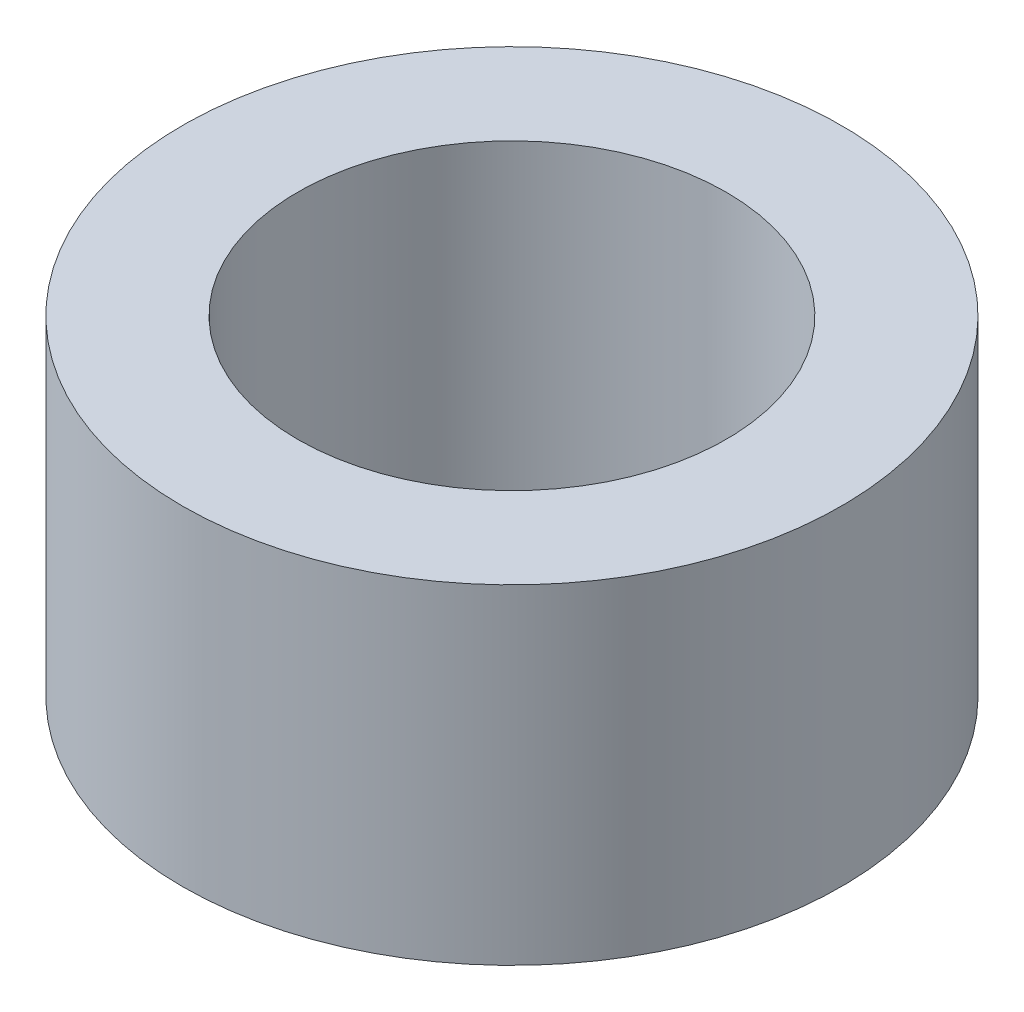
ISO-10303-21;
HEADER;
FILE_DESCRIPTION(('STEP AP214'),'2;1');
FILE_NAME('part.step','',(''),(''),'','','');
FILE_SCHEMA(('AUTOMOTIVE_DESIGN { 1 0 10303 214 1 1 1 1 }'));
ENDSEC;
DATA;
#1=APPLICATION_CONTEXT('core data for automotive mechanical design processes');
#2=APPLICATION_PROTOCOL_DEFINITION('international standard','automotive_design',2000,#1);
#3=PRODUCT_CONTEXT('',#1,'mechanical');
#4=PRODUCT('Part','Part','',(#3));
#5=PRODUCT_RELATED_PRODUCT_CATEGORY('part','',(#4));
#6=PRODUCT_DEFINITION_FORMATION('','',#4);
#7=PRODUCT_DEFINITION_CONTEXT('part definition',#1,'design');
#8=PRODUCT_DEFINITION('design','',#6,#7);
#9=PRODUCT_DEFINITION_SHAPE('','',#8);
#10=(LENGTH_UNIT() NAMED_UNIT(*) SI_UNIT(.MILLI.,.METRE.));
#11=(NAMED_UNIT(*) PLANE_ANGLE_UNIT() SI_UNIT($,.RADIAN.));
#12=(NAMED_UNIT(*) SI_UNIT($,.STERADIAN.) SOLID_ANGLE_UNIT());
#13=UNCERTAINTY_MEASURE_WITH_UNIT(LENGTH_MEASURE(1.E-05),#10,'distance_accuracy_value','');
#14=(GEOMETRIC_REPRESENTATION_CONTEXT(3) GLOBAL_UNCERTAINTY_ASSIGNED_CONTEXT((#13)) GLOBAL_UNIT_ASSIGNED_CONTEXT((#10,
#11,#12)) REPRESENTATION_CONTEXT('',''));
#15=CARTESIAN_POINT('',(0.,0.,0.));
#16=DIRECTION('',(0.,0.,1.));
#17=DIRECTION('',(1.,0.,0.));
#18=AXIS2_PLACEMENT_3D('',#15,#16,#17);
#19=CARTESIAN_POINT('',(0.,5.,0.));
#20=DIRECTION('',(0.,1.,0.));
#21=DIRECTION('',(0.,0.,1.));
#22=AXIS2_PLACEMENT_3D('',#19,#20,#21);
#23=PLANE('',#22);
#24=CARTESIAN_POINT('',(0.,5.,0.));
#25=DIRECTION('',(0.,1.,0.));
#26=DIRECTION('',(0.,0.,1.));
#27=AXIS2_PLACEMENT_3D('',#24,#25,#26);
#28=CIRCLE('',#27,5.);
#29=CARTESIAN_POINT('',(0.,5.,5.));
#30=VERTEX_POINT('',#29);
#31=EDGE_CURVE('E10',#30,#30,#28,.T.);
#32=ORIENTED_EDGE('',*,*,#31,.T.);
#33=EDGE_LOOP('',(#32));
#34=FACE_BOUND('',#33,.T.);
#35=CARTESIAN_POINT('',(0.,5.,0.));
#36=DIRECTION('',(0.,1.,0.));
#37=DIRECTION('',(0.,0.,1.));
#38=AXIS2_PLACEMENT_3D('',#35,#36,#37);
#39=CIRCLE('',#38,3.25);
#40=CARTESIAN_POINT('',(0.,5.,3.25));
#41=VERTEX_POINT('',#40);
#42=EDGE_CURVE('E55',#41,#41,#39,.T.);
#43=ORIENTED_EDGE('',*,*,#42,.F.);
#44=EDGE_LOOP('',(#43));
#45=FACE_BOUND('',#44,.T.);
#46=ADVANCED_FACE('F44',(#34,#45),#23,.T.);
#47=CARTESIAN_POINT('',(0.,0.,0.));
#48=DIRECTION('',(0.,1.,0.));
#49=DIRECTION('',(0.,0.,1.));
#50=AXIS2_PLACEMENT_3D('',#47,#48,#49);
#51=PLANE('',#50);
#52=CARTESIAN_POINT('',(0.,0.,0.));
#53=DIRECTION('',(0.,1.,0.));
#54=DIRECTION('',(0.,0.,1.));
#55=AXIS2_PLACEMENT_3D('',#52,#53,#54);
#56=CIRCLE('',#55,5.);
#57=CARTESIAN_POINT('',(0.,0.,5.));
#58=VERTEX_POINT('',#57);
#59=EDGE_CURVE('E48',#58,#58,#56,.T.);
#60=ORIENTED_EDGE('',*,*,#59,.F.);
#61=EDGE_LOOP('',(#60));
#62=FACE_BOUND('',#61,.T.);
#63=CARTESIAN_POINT('',(0.,0.,0.));
#64=DIRECTION('',(0.,1.,0.));
#65=DIRECTION('',(0.,0.,1.));
#66=AXIS2_PLACEMENT_3D('',#63,#64,#65);
#67=CIRCLE('',#66,3.25);
#68=CARTESIAN_POINT('',(0.,0.,3.25));
#69=VERTEX_POINT('',#68);
#70=EDGE_CURVE('E57',#69,#69,#67,.T.);
#71=ORIENTED_EDGE('',*,*,#70,.T.);
#72=EDGE_LOOP('',(#71));
#73=FACE_BOUND('',#72,.T.);
#74=ADVANCED_FACE('F67',(#62,#73),#51,.F.);
#75=CARTESIAN_POINT('',(0.,5.,0.));
#76=DIRECTION('',(0.,-1.,0.));
#77=DIRECTION('',(0.,0.,-1.));
#78=AXIS2_PLACEMENT_3D('',#75,#76,#77);
#79=CYLINDRICAL_SURFACE('',#78,5.);
#80=ORIENTED_EDGE('',*,*,#31,.F.);
#81=EDGE_LOOP('',(#80));
#82=FACE_BOUND('',#81,.T.);
#83=ORIENTED_EDGE('',*,*,#59,.T.);
#84=EDGE_LOOP('',(#83));
#85=FACE_BOUND('',#84,.T.);
#86=ADVANCED_FACE('F46',(#82,#85),#79,.T.);
#87=CARTESIAN_POINT('',(0.,5.,0.));
#88=DIRECTION('',(0.,-1.,0.));
#89=DIRECTION('',(0.,0.,-1.));
#90=AXIS2_PLACEMENT_3D('',#87,#88,#89);
#91=CYLINDRICAL_SURFACE('',#90,3.25);
#92=ORIENTED_EDGE('',*,*,#42,.T.);
#93=EDGE_LOOP('',(#92));
#94=FACE_BOUND('',#93,.T.);
#95=ORIENTED_EDGE('',*,*,#70,.F.);
#96=EDGE_LOOP('',(#95));
#97=FACE_BOUND('',#96,.T.);
#98=ADVANCED_FACE('F63',(#94,#97),#91,.F.);
#99=CLOSED_SHELL('',(#46,#74,#86,#98));
#100=MANIFOLD_SOLID_BREP('B2',#99);
#101=ADVANCED_BREP_SHAPE_REPRESENTATION('',(#18,#100),#14);
#102=SHAPE_DEFINITION_REPRESENTATION(#9,#101);
ENDSEC;
END-ISO-10303-21;
